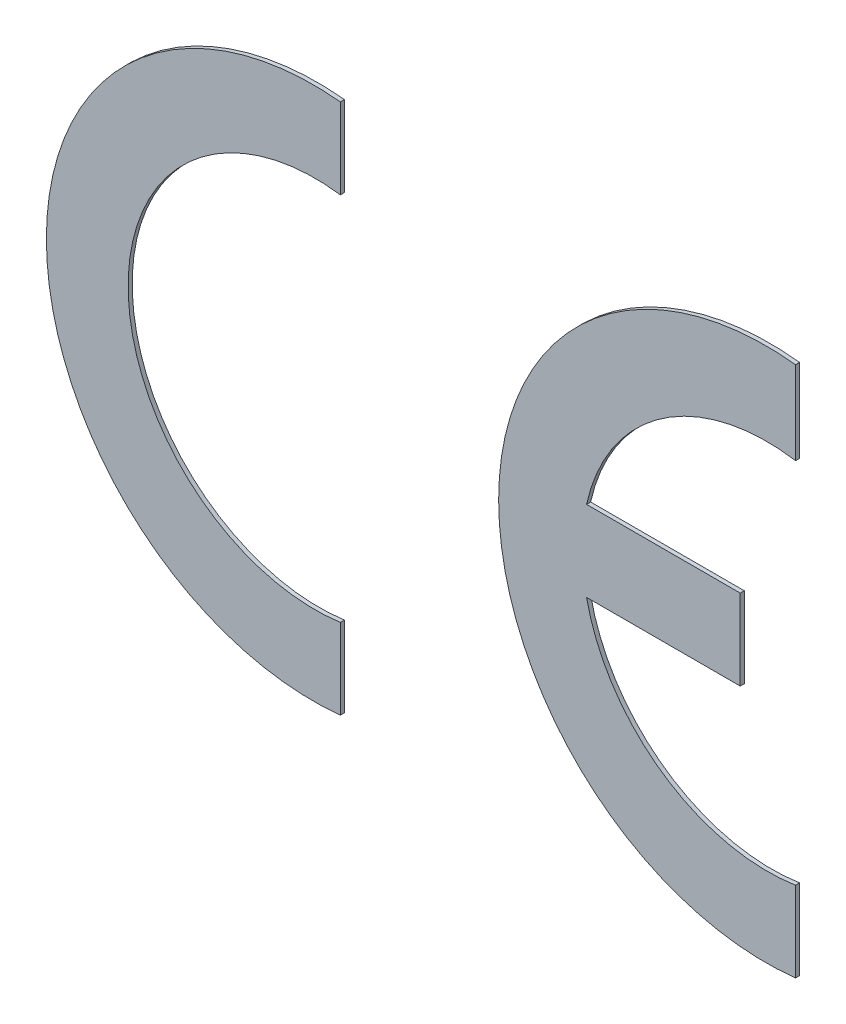
ISO-10303-21;
HEADER;
FILE_DESCRIPTION(('STEP AP214'),'2;1');
FILE_NAME('part.step','',(''),(''),'','','');
FILE_SCHEMA(('AUTOMOTIVE_DESIGN { 1 0 10303 214 1 1 1 1 }'));
ENDSEC;
DATA;
#1=APPLICATION_CONTEXT('core data for automotive mechanical design processes');
#2=APPLICATION_PROTOCOL_DEFINITION('international standard','automotive_design',2000,#1);
#3=PRODUCT_CONTEXT('',#1,'mechanical');
#4=PRODUCT('Part','Part','',(#3));
#5=PRODUCT_RELATED_PRODUCT_CATEGORY('part','',(#4));
#6=PRODUCT_DEFINITION_FORMATION('','',#4);
#7=PRODUCT_DEFINITION_CONTEXT('part definition',#1,'design');
#8=PRODUCT_DEFINITION('design','',#6,#7);
#9=PRODUCT_DEFINITION_SHAPE('','',#8);
#10=(LENGTH_UNIT() NAMED_UNIT(*) SI_UNIT(.MILLI.,.METRE.));
#11=(NAMED_UNIT(*) PLANE_ANGLE_UNIT() SI_UNIT($,.RADIAN.));
#12=(NAMED_UNIT(*) SI_UNIT($,.STERADIAN.) SOLID_ANGLE_UNIT());
#13=UNCERTAINTY_MEASURE_WITH_UNIT(LENGTH_MEASURE(1.E-05),#10,'distance_accuracy_value','');
#14=(GEOMETRIC_REPRESENTATION_CONTEXT(3) GLOBAL_UNCERTAINTY_ASSIGNED_CONTEXT((#13)) GLOBAL_UNIT_ASSIGNED_CONTEXT((#10,
#11,#12)) REPRESENTATION_CONTEXT('',''));
#15=CARTESIAN_POINT('',(0.,0.,0.));
#16=DIRECTION('',(0.,0.,1.));
#17=DIRECTION('',(1.,0.,0.));
#18=AXIS2_PLACEMENT_3D('',#15,#16,#17);
#19=CARTESIAN_POINT('',(8.8598674286041,3.30312044152455,0.));
#20=DIRECTION('',(0.,0.,1.));
#21=DIRECTION('',(1.,0.,0.));
#22=AXIS2_PLACEMENT_3D('',#19,#20,#21);
#23=PLANE('',#22);
#24=DIRECTION('',(1.,0.,0.));
#25=VECTOR('',#24,1.);
#26=CARTESIAN_POINT('',(8.53696437791858,3.79052127529094,0.));
#27=LINE('',#26,#25);
#28=CARTESIAN_POINT('',(6.64827432209034,3.79052127529094,0.));
#29=VERTEX_POINT('',#28);
#30=CARTESIAN_POINT('',(8.53696437791858,3.79052127529094,0.));
#31=VERTEX_POINT('',#30);
#32=EDGE_CURVE('P0_E105',#29,#31,#27,.T.);
#33=ORIENTED_EDGE('',*,*,#32,.T.);
#34=DIRECTION('',(0.,1.,0.));
#35=VECTOR('',#34,1.);
#36=CARTESIAN_POINT('',(8.53696437791858,2.80058932963335,0.));
#37=LINE('',#36,#35);
#38=CARTESIAN_POINT('',(8.53696437791858,2.80058932963335,0.));
#39=VERTEX_POINT('',#38);
#40=EDGE_CURVE('P0_E110',#31,#39,#37,.F.);
#41=ORIENTED_EDGE('',*,*,#40,.T.);
#42=DIRECTION('',(1.,0.,0.));
#43=VECTOR('',#42,1.);
#44=CARTESIAN_POINT('',(6.64827432209034,2.80058932963335,0.));
#45=LINE('',#44,#43);
#46=CARTESIAN_POINT('',(6.64827432209034,2.80058932963335,0.));
#47=VERTEX_POINT('',#46);
#48=EDGE_CURVE('P0_E116',#39,#47,#45,.F.);
#49=ORIENTED_EDGE('',*,*,#48,.T.);
#50=CARTESIAN_POINT('',(8.87271891685303,3.26763789219556,0.));
#51=DIRECTION('',(0.,0.,-1.));
#52=DIRECTION('',(-1.,0.,0.));
#53=AXIS2_PLACEMENT_3D('',#50,#51,#52);
#54=CIRCLE('',#53,2.27294701103224);
#55=CARTESIAN_POINT('',(9.21700820288481,1.02091739278222,0.));
#56=VERTEX_POINT('',#55);
#57=EDGE_CURVE('P0_E134',#47,#56,#54,.F.);
#58=ORIENTED_EDGE('',*,*,#57,.T.);
#59=DIRECTION('',(0.,1.,0.));
#60=VECTOR('',#59,1.);
#61=CARTESIAN_POINT('',(9.21700820288481,1.02091739278222,0.));
#62=LINE('',#61,#60);
#63=CARTESIAN_POINT('',(9.21700820288481,0.0333379167653995,0.));
#64=VERTEX_POINT('',#63);
#65=EDGE_CURVE('P0_E122',#56,#64,#62,.F.);
#66=ORIENTED_EDGE('',*,*,#65,.T.);
#67=CARTESIAN_POINT('',(8.8518876588756,3.29738447584218,0.));
#68=DIRECTION('',(0.,0.,-1.));
#69=DIRECTION('',(-1.,0.,0.));
#70=AXIS2_PLACEMENT_3D('',#67,#68,#69);
#71=CIRCLE('',#70,3.28440450484993);
#72=CARTESIAN_POINT('',(9.21700820288481,6.56143103491895,0.));
#73=VERTEX_POINT('',#72);
#74=EDGE_CURVE('P0_E92',#73,#64,#71,.F.);
#75=ORIENTED_EDGE('',*,*,#74,.F.);
#76=DIRECTION('',(0.,1.,0.));
#77=VECTOR('',#76,1.);
#78=CARTESIAN_POINT('',(9.21700820288481,6.56143103491895,0.));
#79=LINE('',#78,#77);
#80=CARTESIAN_POINT('',(9.21700820288481,5.53944647072547,0.));
#81=VERTEX_POINT('',#80);
#82=EDGE_CURVE('P0_E90',#73,#81,#79,.F.);
#83=ORIENTED_EDGE('',*,*,#82,.T.);
#84=CARTESIAN_POINT('',(8.8598674286041,3.30312044152455,0.));
#85=DIRECTION('',(0.,0.,-1.));
#86=DIRECTION('',(-1.,0.,0.));
#87=AXIS2_PLACEMENT_3D('',#84,#85,#86);
#88=CIRCLE('',#87,2.26466413437741);
#89=EDGE_CURVE('P0_E20',#81,#29,#88,.F.);
#90=ORIENTED_EDGE('',*,*,#89,.T.);
#91=EDGE_LOOP('',(#33,#41,#49,#58,#66,#75,#83,#90));
#92=FACE_BOUND('',#91,.T.);
#93=ADVANCED_FACE('P0_F17',(#92),#23,.F.);
#94=CARTESIAN_POINT('',(8.8598674286041,3.30312044152455,0.05));
#95=DIRECTION('',(0.,0.,-1.));
#96=DIRECTION('',(-1.,0.,0.));
#97=AXIS2_PLACEMENT_3D('',#94,#95,#96);
#98=CYLINDRICAL_SURFACE('',#97,2.26466413437741);
#99=DIRECTION('',(0.,0.,1.));
#100=VECTOR('',#99,1.);
#101=CARTESIAN_POINT('',(9.21700820288481,5.53944647072547,0.05));
#102=LINE('',#101,#100);
#103=CARTESIAN_POINT('',(9.21700820288481,5.53944647072547,0.05));
#104=VERTEX_POINT('',#103);
#105=EDGE_CURVE('P0_E82',#81,#104,#102,.T.);
#106=ORIENTED_EDGE('',*,*,#105,.T.);
#107=CARTESIAN_POINT('',(8.8598674286041,3.30312044152455,0.05));
#108=DIRECTION('',(0.,0.,-1.));
#109=DIRECTION('',(-1.,0.,0.));
#110=AXIS2_PLACEMENT_3D('',#107,#108,#109);
#111=CIRCLE('',#110,2.26466413437741);
#112=CARTESIAN_POINT('',(6.64827432209034,3.79052127529094,0.05));
#113=VERTEX_POINT('',#112);
#114=EDGE_CURVE('P0_E107',#113,#104,#111,.T.);
#115=ORIENTED_EDGE('',*,*,#114,.F.);
#116=DIRECTION('',(0.,0.,-1.));
#117=VECTOR('',#116,1.);
#118=CARTESIAN_POINT('',(6.64827432209034,3.79052127529094,0.05));
#119=LINE('',#118,#117);
#120=EDGE_CURVE('P0_E85',#113,#29,#119,.T.);
#121=ORIENTED_EDGE('',*,*,#120,.T.);
#122=ORIENTED_EDGE('',*,*,#89,.F.);
#123=EDGE_LOOP('',(#106,#115,#121,#122));
#124=FACE_BOUND('',#123,.T.);
#125=ADVANCED_FACE('P0_F80',(#124),#98,.F.);
#126=CARTESIAN_POINT('',(9.21700820288481,6.56143103491895,0.05));
#127=DIRECTION('',(-1.,0.,0.));
#128=DIRECTION('',(0.,0.,1.));
#129=AXIS2_PLACEMENT_3D('',#126,#127,#128);
#130=PLANE('',#129);
#131=DIRECTION('',(0.,0.,-1.));
#132=VECTOR('',#131,1.);
#133=CARTESIAN_POINT('',(9.21700820288481,6.56143103491895,0.05));
#134=LINE('',#133,#132);
#135=CARTESIAN_POINT('',(9.21700820288481,6.56143103491895,0.05));
#136=VERTEX_POINT('',#135);
#137=EDGE_CURVE('P0_E95',#136,#73,#134,.T.);
#138=ORIENTED_EDGE('',*,*,#137,.F.);
#139=DIRECTION('',(0.,1.,0.));
#140=VECTOR('',#139,1.);
#141=CARTESIAN_POINT('',(9.21700820288481,3.30312044152455,0.05));
#142=LINE('',#141,#140);
#143=EDGE_CURVE('P0_E99',#104,#136,#142,.T.);
#144=ORIENTED_EDGE('',*,*,#143,.F.);
#145=ORIENTED_EDGE('',*,*,#105,.F.);
#146=ORIENTED_EDGE('',*,*,#82,.F.);
#147=EDGE_LOOP('',(#138,#144,#145,#146));
#148=FACE_BOUND('',#147,.T.);
#149=ADVANCED_FACE('P0_F97',(#148),#130,.F.);
#150=CARTESIAN_POINT('',(8.8518876588756,3.29738447584218,0.05));
#151=DIRECTION('',(0.,0.,-1.));
#152=DIRECTION('',(-1.,0.,0.));
#153=AXIS2_PLACEMENT_3D('',#150,#151,#152);
#154=CYLINDRICAL_SURFACE('',#153,3.28440450484993);
#155=ORIENTED_EDGE('',*,*,#74,.T.);
#156=DIRECTION('',(0.,0.,1.));
#157=VECTOR('',#156,1.);
#158=CARTESIAN_POINT('',(9.21700820288481,0.0333379167653997,0.05));
#159=LINE('',#158,#157);
#160=CARTESIAN_POINT('',(9.21700820288481,0.0333379167653997,0.05));
#161=VERTEX_POINT('',#160);
#162=EDGE_CURVE('P0_E124',#64,#161,#159,.T.);
#163=ORIENTED_EDGE('',*,*,#162,.T.);
#164=CARTESIAN_POINT('',(8.8518876588756,3.29738447584218,0.05));
#165=DIRECTION('',(0.,0.,-1.));
#166=DIRECTION('',(-1.,0.,0.));
#167=AXIS2_PLACEMENT_3D('',#164,#165,#166);
#168=CIRCLE('',#167,3.28440450484993);
#169=EDGE_CURVE('P0_E131',#136,#161,#168,.F.);
#170=ORIENTED_EDGE('',*,*,#169,.F.);
#171=ORIENTED_EDGE('',*,*,#137,.T.);
#172=EDGE_LOOP('',(#155,#163,#170,#171));
#173=FACE_BOUND('',#172,.T.);
#174=ADVANCED_FACE('P0_F139',(#173),#154,.T.);
#175=CARTESIAN_POINT('',(9.21700820288481,1.02091739278222,0.05));
#176=DIRECTION('',(-1.,0.,0.));
#177=DIRECTION('',(0.,0.,1.));
#178=AXIS2_PLACEMENT_3D('',#175,#176,#177);
#179=PLANE('',#178);
#180=DIRECTION('',(0.,0.,-1.));
#181=VECTOR('',#180,1.);
#182=CARTESIAN_POINT('',(9.21700820288481,1.02091739278222,0.05));
#183=LINE('',#182,#181);
#184=CARTESIAN_POINT('',(9.21700820288481,1.02091739278222,0.05));
#185=VERTEX_POINT('',#184);
#186=EDGE_CURVE('P0_E123',#56,#185,#183,.F.);
#187=ORIENTED_EDGE('',*,*,#186,.T.);
#188=DIRECTION('',(0.,1.,0.));
#189=VECTOR('',#188,1.);
#190=CARTESIAN_POINT('',(9.21700820288481,3.30312044152455,0.05));
#191=LINE('',#190,#189);
#192=EDGE_CURVE('P0_E130',#161,#185,#191,.T.);
#193=ORIENTED_EDGE('',*,*,#192,.F.);
#194=ORIENTED_EDGE('',*,*,#162,.F.);
#195=ORIENTED_EDGE('',*,*,#65,.F.);
#196=EDGE_LOOP('',(#187,#193,#194,#195));
#197=FACE_BOUND('',#196,.T.);
#198=ADVANCED_FACE('P0_F164',(#197),#179,.F.);
#199=CARTESIAN_POINT('',(8.87271891685303,3.26763789219556,0.05));
#200=DIRECTION('',(0.,0.,-1.));
#201=DIRECTION('',(-1.,0.,0.));
#202=AXIS2_PLACEMENT_3D('',#199,#200,#201);
#203=CYLINDRICAL_SURFACE('',#202,2.27294701103224);
#204=DIRECTION('',(0.,0.,1.));
#205=VECTOR('',#204,1.);
#206=CARTESIAN_POINT('',(6.64827432209034,2.80058932963335,0.05));
#207=LINE('',#206,#205);
#208=CARTESIAN_POINT('',(6.64827432209034,2.80058932963335,0.05));
#209=VERTEX_POINT('',#208);
#210=EDGE_CURVE('P0_E119',#47,#209,#207,.T.);
#211=ORIENTED_EDGE('',*,*,#210,.T.);
#212=CARTESIAN_POINT('',(8.87271891685303,3.26763789219556,0.05));
#213=DIRECTION('',(0.,0.,-1.));
#214=DIRECTION('',(-1.,0.,0.));
#215=AXIS2_PLACEMENT_3D('',#212,#213,#214);
#216=CIRCLE('',#215,2.27294701103224);
#217=EDGE_CURVE('P0_E126',#185,#209,#216,.T.);
#218=ORIENTED_EDGE('',*,*,#217,.F.);
#219=ORIENTED_EDGE('',*,*,#186,.F.);
#220=ORIENTED_EDGE('',*,*,#57,.F.);
#221=EDGE_LOOP('',(#211,#218,#219,#220));
#222=FACE_BOUND('',#221,.T.);
#223=ADVANCED_FACE('P0_F166',(#222),#203,.F.);
#224=CARTESIAN_POINT('',(6.64827432209034,2.80058932963335,0.05));
#225=DIRECTION('',(0.,1.,0.));
#226=DIRECTION('',(0.,0.,1.));
#227=AXIS2_PLACEMENT_3D('',#224,#225,#226);
#228=PLANE('',#227);
#229=DIRECTION('',(0.,0.,1.));
#230=VECTOR('',#229,1.);
#231=CARTESIAN_POINT('',(8.53696437791858,2.80058932963335,0.05));
#232=LINE('',#231,#230);
#233=CARTESIAN_POINT('',(8.53696437791858,2.80058932963335,0.05));
#234=VERTEX_POINT('',#233);
#235=EDGE_CURVE('P0_E113',#39,#234,#232,.T.);
#236=ORIENTED_EDGE('',*,*,#235,.T.);
#237=DIRECTION('',(1.,0.,0.));
#238=VECTOR('',#237,1.);
#239=CARTESIAN_POINT('',(8.8598674286041,2.80058932963335,0.05));
#240=LINE('',#239,#238);
#241=EDGE_CURVE('P0_E129',#209,#234,#240,.T.);
#242=ORIENTED_EDGE('',*,*,#241,.F.);
#243=ORIENTED_EDGE('',*,*,#210,.F.);
#244=ORIENTED_EDGE('',*,*,#48,.F.);
#245=EDGE_LOOP('',(#236,#242,#243,#244));
#246=FACE_BOUND('',#245,.T.);
#247=ADVANCED_FACE('P0_F175',(#246),#228,.F.);
#248=CARTESIAN_POINT('',(8.53696437791858,2.80058932963335,0.05));
#249=DIRECTION('',(-1.,0.,0.));
#250=DIRECTION('',(0.,0.,1.));
#251=AXIS2_PLACEMENT_3D('',#248,#249,#250);
#252=PLANE('',#251);
#253=DIRECTION('',(0.,0.,-1.));
#254=VECTOR('',#253,1.);
#255=CARTESIAN_POINT('',(8.53696437791858,3.79052127529094,0.05));
#256=LINE('',#255,#254);
#257=CARTESIAN_POINT('',(8.53696437791858,3.79052127529094,0.05));
#258=VERTEX_POINT('',#257);
#259=EDGE_CURVE('P0_E35',#31,#258,#256,.F.);
#260=ORIENTED_EDGE('',*,*,#259,.T.);
#261=DIRECTION('',(0.,1.,0.));
#262=VECTOR('',#261,1.);
#263=CARTESIAN_POINT('',(8.53696437791858,3.30312044152455,0.05));
#264=LINE('',#263,#262);
#265=EDGE_CURVE('P0_E26',#234,#258,#264,.T.);
#266=ORIENTED_EDGE('',*,*,#265,.F.);
#267=ORIENTED_EDGE('',*,*,#235,.F.);
#268=ORIENTED_EDGE('',*,*,#40,.F.);
#269=EDGE_LOOP('',(#260,#266,#267,#268));
#270=FACE_BOUND('',#269,.T.);
#271=ADVANCED_FACE('P0_F177',(#270),#252,.F.);
#272=CARTESIAN_POINT('',(8.53696437791858,3.79052127529094,0.05));
#273=DIRECTION('',(0.,-1.,0.));
#274=DIRECTION('',(0.,0.,-1.));
#275=AXIS2_PLACEMENT_3D('',#272,#273,#274);
#276=PLANE('',#275);
#277=ORIENTED_EDGE('',*,*,#120,.F.);
#278=DIRECTION('',(1.,0.,0.));
#279=VECTOR('',#278,1.);
#280=CARTESIAN_POINT('',(8.8598674286041,3.79052127529094,0.05));
#281=LINE('',#280,#279);
#282=EDGE_CURVE('P0_E11',#258,#113,#281,.F.);
#283=ORIENTED_EDGE('',*,*,#282,.F.);
#284=ORIENTED_EDGE('',*,*,#259,.F.);
#285=ORIENTED_EDGE('',*,*,#32,.F.);
#286=EDGE_LOOP('',(#277,#283,#284,#285));
#287=FACE_BOUND('',#286,.T.);
#288=ADVANCED_FACE('P0_F179',(#287),#276,.F.);
#289=CARTESIAN_POINT('',(8.8598674286041,3.30312044152455,0.05));
#290=DIRECTION('',(0.,0.,1.));
#291=DIRECTION('',(1.,0.,0.));
#292=AXIS2_PLACEMENT_3D('',#289,#290,#291);
#293=PLANE('',#292);
#294=ORIENTED_EDGE('',*,*,#265,.T.);
#295=ORIENTED_EDGE('',*,*,#282,.T.);
#296=ORIENTED_EDGE('',*,*,#114,.T.);
#297=ORIENTED_EDGE('',*,*,#143,.T.);
#298=ORIENTED_EDGE('',*,*,#169,.T.);
#299=ORIENTED_EDGE('',*,*,#192,.T.);
#300=ORIENTED_EDGE('',*,*,#217,.T.);
#301=ORIENTED_EDGE('',*,*,#241,.T.);
#302=EDGE_LOOP('',(#294,#295,#296,#297,#298,#299,#300,#301));
#303=FACE_BOUND('',#302,.T.);
#304=ADVANCED_FACE('P0_F145',(#303),#293,.T.);
#305=CLOSED_SHELL('',(#93,#125,#149,#174,#198,#223,#247,#271,#288,#304));
#306=MANIFOLD_SOLID_BREP('P0_B1',#305);
#307=CARTESIAN_POINT('',(3.3101503625402,3.29631435812287,0.));
#308=DIRECTION('',(0.,0.,1.));
#309=DIRECTION('',(1.,0.,0.));
#310=AXIS2_PLACEMENT_3D('',#307,#308,#309);
#311=PLANE('',#310);
#312=DIRECTION('',(0.,1.,0.));
#313=VECTOR('',#312,1.);
#314=CARTESIAN_POINT('',(3.62220135231767,3.29631435812287,0.));
#315=LINE('',#314,#313);
#316=CARTESIAN_POINT('',(3.62220135231767,0.0333379167653989,0.));
#317=VERTEX_POINT('',#316);
#318=CARTESIAN_POINT('',(3.62220135231767,1.02091739278222,0.));
#319=VERTEX_POINT('',#318);
#320=EDGE_CURVE('P1_E64',#317,#319,#315,.T.);
#321=ORIENTED_EDGE('',*,*,#320,.F.);
#322=CARTESIAN_POINT('',(3.289544809005,3.29738447584218,0.));
#323=DIRECTION('',(0.,0.,-1.));
#324=DIRECTION('',(-1.,0.,0.));
#325=AXIS2_PLACEMENT_3D('',#322,#323,#324);
#326=CIRCLE('',#325,3.2809541776181);
#327=CARTESIAN_POINT('',(3.62220135231767,6.56143103491895,0.));
#328=VERTEX_POINT('',#327);
#329=EDGE_CURVE('P1_E68',#328,#317,#326,.F.);
#330=ORIENTED_EDGE('',*,*,#329,.F.);
#331=DIRECTION('',(0.,1.,0.));
#332=VECTOR('',#331,1.);
#333=CARTESIAN_POINT('',(3.62220135231768,6.56143103491895,0.));
#334=LINE('',#333,#332);
#335=CARTESIAN_POINT('',(3.62220135231768,5.57171132346352,0.));
#336=VERTEX_POINT('',#335);
#337=EDGE_CURVE('P1_E66',#328,#336,#334,.F.);
#338=ORIENTED_EDGE('',*,*,#337,.T.);
#339=CARTESIAN_POINT('',(3.3101503625402,3.29631435812287,0.));
#340=DIRECTION('',(0.,0.,-1.));
#341=DIRECTION('',(-1.,0.,0.));
#342=AXIS2_PLACEMENT_3D('',#339,#340,#341);
#343=CIRCLE('',#342,2.29669483608566);
#344=EDGE_CURVE('P1_E20',#336,#319,#343,.F.);
#345=ORIENTED_EDGE('',*,*,#344,.T.);
#346=EDGE_LOOP('',(#321,#330,#338,#345));
#347=FACE_BOUND('',#346,.T.);
#348=ADVANCED_FACE('P1_F17',(#347),#311,.F.);
#349=CARTESIAN_POINT('',(3.3101503625402,3.29631435812287,0.05));
#350=DIRECTION('',(0.,0.,-1.));
#351=DIRECTION('',(-1.,0.,0.));
#352=AXIS2_PLACEMENT_3D('',#349,#350,#351);
#353=CYLINDRICAL_SURFACE('',#352,2.29669483608566);
#354=DIRECTION('',(0.,0.,1.));
#355=VECTOR('',#354,1.);
#356=CARTESIAN_POINT('',(3.62220135231768,5.57171132346352,0.05));
#357=LINE('',#356,#355);
#358=CARTESIAN_POINT('',(3.62220135231768,5.57171132346352,0.05));
#359=VERTEX_POINT('',#358);
#360=EDGE_CURVE('P1_E58',#336,#359,#357,.T.);
#361=ORIENTED_EDGE('',*,*,#360,.T.);
#362=CARTESIAN_POINT('',(3.3101503625402,3.29631435812287,0.05));
#363=DIRECTION('',(0.,0.,-1.));
#364=DIRECTION('',(-1.,0.,0.));
#365=AXIS2_PLACEMENT_3D('',#362,#363,#364);
#366=CIRCLE('',#365,2.29669483608566);
#367=CARTESIAN_POINT('',(3.62220135231767,1.02091739278222,0.05));
#368=VERTEX_POINT('',#367);
#369=EDGE_CURVE('P1_E81',#368,#359,#366,.T.);
#370=ORIENTED_EDGE('',*,*,#369,.F.);
#371=DIRECTION('',(0.,0.,1.));
#372=VECTOR('',#371,1.);
#373=CARTESIAN_POINT('',(3.62220135231768,1.02091739278222,0.05));
#374=LINE('',#373,#372);
#375=EDGE_CURVE('P1_E61',#368,#319,#374,.F.);
#376=ORIENTED_EDGE('',*,*,#375,.T.);
#377=ORIENTED_EDGE('',*,*,#344,.F.);
#378=EDGE_LOOP('',(#361,#370,#376,#377));
#379=FACE_BOUND('',#378,.T.);
#380=ADVANCED_FACE('P1_F56',(#379),#353,.F.);
#381=CARTESIAN_POINT('',(3.62220135231768,6.56143103491895,0.05));
#382=DIRECTION('',(-1.,0.,0.));
#383=DIRECTION('',(0.,0.,1.));
#384=AXIS2_PLACEMENT_3D('',#381,#382,#383);
#385=PLANE('',#384);
#386=DIRECTION('',(0.,0.,-1.));
#387=VECTOR('',#386,1.);
#388=CARTESIAN_POINT('',(3.62220135231767,6.56143103491895,0.05));
#389=LINE('',#388,#387);
#390=CARTESIAN_POINT('',(3.62220135231767,6.56143103491895,0.05));
#391=VERTEX_POINT('',#390);
#392=EDGE_CURVE('P1_E71',#391,#328,#389,.T.);
#393=ORIENTED_EDGE('',*,*,#392,.F.);
#394=DIRECTION('',(0.,1.,0.));
#395=VECTOR('',#394,1.);
#396=CARTESIAN_POINT('',(3.62220135231768,3.29631435812287,0.05));
#397=LINE('',#396,#395);
#398=EDGE_CURVE('P1_E74',#359,#391,#397,.T.);
#399=ORIENTED_EDGE('',*,*,#398,.F.);
#400=ORIENTED_EDGE('',*,*,#360,.F.);
#401=ORIENTED_EDGE('',*,*,#337,.F.);
#402=EDGE_LOOP('',(#393,#399,#400,#401));
#403=FACE_BOUND('',#402,.T.);
#404=ADVANCED_FACE('P1_F73',(#403),#385,.F.);
#405=CARTESIAN_POINT('',(3.289544809005,3.29738447584218,0.05));
#406=DIRECTION('',(0.,0.,-1.));
#407=DIRECTION('',(-1.,0.,0.));
#408=AXIS2_PLACEMENT_3D('',#405,#406,#407);
#409=CYLINDRICAL_SURFACE('',#408,3.2809541776181);
#410=ORIENTED_EDGE('',*,*,#329,.T.);
#411=DIRECTION('',(0.,0.,1.));
#412=VECTOR('',#411,1.);
#413=CARTESIAN_POINT('',(3.62220135231768,0.0333379167653989,0.05));
#414=LINE('',#413,#412);
#415=CARTESIAN_POINT('',(3.62220135231767,0.0333379167653989,0.05));
#416=VERTEX_POINT('',#415);
#417=EDGE_CURVE('P1_E82',#317,#416,#414,.T.);
#418=ORIENTED_EDGE('',*,*,#417,.T.);
#419=CARTESIAN_POINT('',(3.289544809005,3.29738447584218,0.05));
#420=DIRECTION('',(0.,0.,-1.));
#421=DIRECTION('',(-1.,0.,0.));
#422=AXIS2_PLACEMENT_3D('',#419,#420,#421);
#423=CIRCLE('',#422,3.2809541776181);
#424=EDGE_CURVE('P1_E26',#391,#416,#423,.F.);
#425=ORIENTED_EDGE('',*,*,#424,.F.);
#426=ORIENTED_EDGE('',*,*,#392,.T.);
#427=EDGE_LOOP('',(#410,#418,#425,#426));
#428=FACE_BOUND('',#427,.T.);
#429=ADVANCED_FACE('P1_F86',(#428),#409,.T.);
#430=CARTESIAN_POINT('',(3.62220135231768,1.02091739278222,0.05));
#431=DIRECTION('',(-1.,0.,0.));
#432=DIRECTION('',(0.,0.,1.));
#433=AXIS2_PLACEMENT_3D('',#430,#431,#432);
#434=PLANE('',#433);
#435=ORIENTED_EDGE('',*,*,#375,.F.);
#436=DIRECTION('',(0.,1.,0.));
#437=VECTOR('',#436,1.);
#438=CARTESIAN_POINT('',(3.62220135231767,3.29631435812287,0.05));
#439=LINE('',#438,#437);
#440=EDGE_CURVE('P1_E11',#416,#368,#439,.T.);
#441=ORIENTED_EDGE('',*,*,#440,.F.);
#442=ORIENTED_EDGE('',*,*,#417,.F.);
#443=ORIENTED_EDGE('',*,*,#320,.T.);
#444=EDGE_LOOP('',(#435,#441,#442,#443));
#445=FACE_BOUND('',#444,.T.);
#446=ADVANCED_FACE('P1_F91',(#445),#434,.F.);
#447=CARTESIAN_POINT('',(3.3101503625402,3.29631435812287,0.05));
#448=DIRECTION('',(0.,0.,1.));
#449=DIRECTION('',(1.,0.,0.));
#450=AXIS2_PLACEMENT_3D('',#447,#448,#449);
#451=PLANE('',#450);
#452=ORIENTED_EDGE('',*,*,#424,.T.);
#453=ORIENTED_EDGE('',*,*,#440,.T.);
#454=ORIENTED_EDGE('',*,*,#369,.T.);
#455=ORIENTED_EDGE('',*,*,#398,.T.);
#456=EDGE_LOOP('',(#452,#453,#454,#455));
#457=FACE_BOUND('',#456,.T.);
#458=ADVANCED_FACE('P1_F88',(#457),#451,.T.);
#459=CLOSED_SHELL('',(#348,#380,#404,#429,#446,#458));
#460=MANIFOLD_SOLID_BREP('P1_B1',#459);
#461=ADVANCED_BREP_SHAPE_REPRESENTATION('',(#18,#306,#460),#14);
#462=SHAPE_DEFINITION_REPRESENTATION(#9,#461);
ENDSEC;
END-ISO-10303-21;
